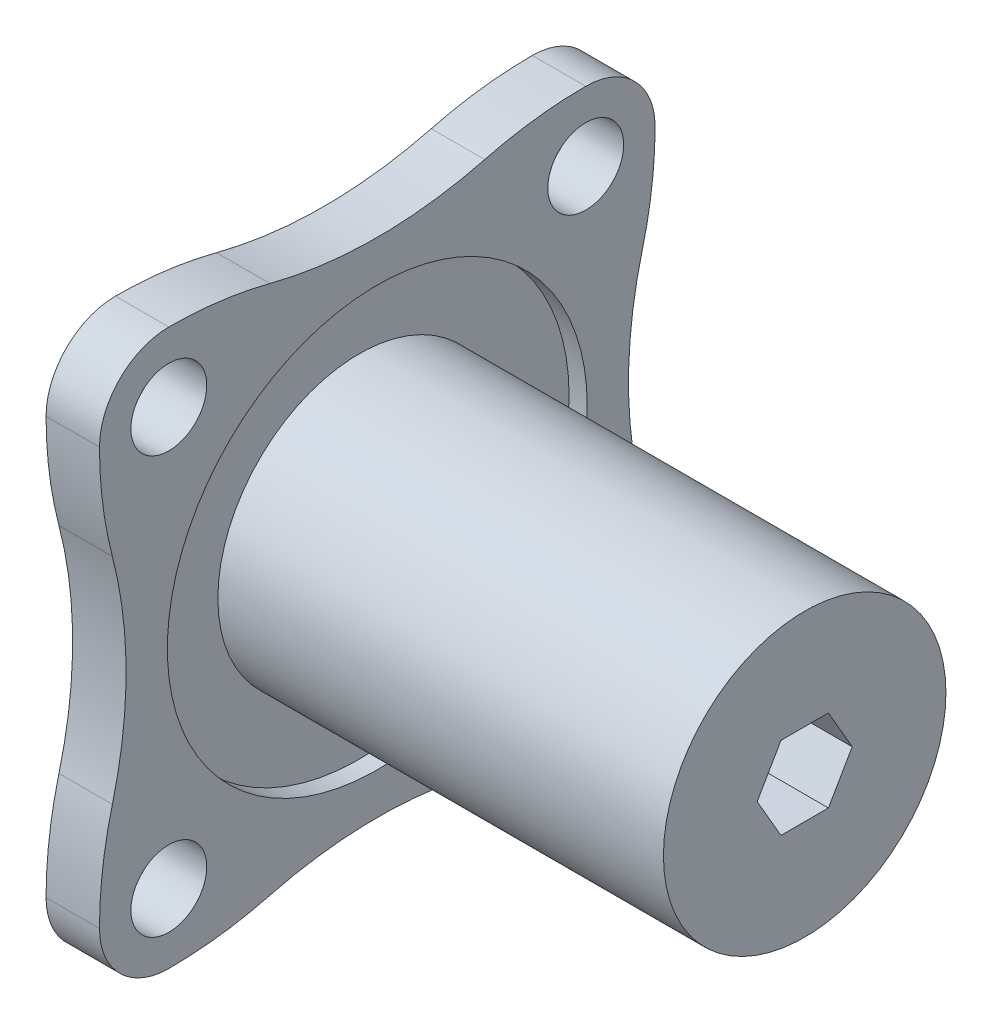
ISO-10303-21;
HEADER;
FILE_DESCRIPTION(('STEP AP214'),'2;1');
FILE_NAME('part.step','',(''),(''),'','','');
FILE_SCHEMA(('AUTOMOTIVE_DESIGN { 1 0 10303 214 1 1 1 1 }'));
ENDSEC;
DATA;
#1=APPLICATION_CONTEXT('core data for automotive mechanical design processes');
#2=APPLICATION_PROTOCOL_DEFINITION('international standard','automotive_design',2000,#1);
#3=PRODUCT_CONTEXT('',#1,'mechanical');
#4=PRODUCT('Part','Part','',(#3));
#5=PRODUCT_RELATED_PRODUCT_CATEGORY('part','',(#4));
#6=PRODUCT_DEFINITION_FORMATION('','',#4);
#7=PRODUCT_DEFINITION_CONTEXT('part definition',#1,'design');
#8=PRODUCT_DEFINITION('design','',#6,#7);
#9=PRODUCT_DEFINITION_SHAPE('','',#8);
#10=(LENGTH_UNIT() NAMED_UNIT(*) SI_UNIT(.MILLI.,.METRE.));
#11=(NAMED_UNIT(*) PLANE_ANGLE_UNIT() SI_UNIT($,.RADIAN.));
#12=(NAMED_UNIT(*) SI_UNIT($,.STERADIAN.) SOLID_ANGLE_UNIT());
#13=UNCERTAINTY_MEASURE_WITH_UNIT(LENGTH_MEASURE(1.E-05),#10,'distance_accuracy_value','');
#14=(GEOMETRIC_REPRESENTATION_CONTEXT(3) GLOBAL_UNCERTAINTY_ASSIGNED_CONTEXT((#13)) GLOBAL_UNIT_ASSIGNED_CONTEXT((#10,
#11,#12)) REPRESENTATION_CONTEXT('',''));
#15=CARTESIAN_POINT('',(0.,0.,0.));
#16=DIRECTION('',(0.,0.,1.));
#17=DIRECTION('',(1.,0.,0.));
#18=AXIS2_PLACEMENT_3D('',#15,#16,#17);
#19=CARTESIAN_POINT('',(50.8,0.,0.));
#20=DIRECTION('',(1.,0.,0.));
#21=DIRECTION('',(0.,0.,-1.));
#22=AXIS2_PLACEMENT_3D('',#19,#20,#21);
#23=PLANE('',#22);
#24=CARTESIAN_POINT('',(50.8,0.,0.));
#25=DIRECTION('',(1.,0.,0.));
#26=DIRECTION('',(0.,0.,-1.));
#27=AXIS2_PLACEMENT_3D('',#24,#25,#26);
#28=CIRCLE('',#27,16.7894);
#29=CARTESIAN_POINT('',(50.8,0.,-16.7894));
#30=VERTEX_POINT('',#29);
#31=EDGE_CURVE('E11',#30,#30,#28,.T.);
#32=ORIENTED_EDGE('',*,*,#31,.T.);
#33=EDGE_LOOP('',(#32));
#34=FACE_BOUND('',#33,.T.);
#35=DIRECTION('',(0.,0.,-1.));
#36=VECTOR('',#35,1.);
#37=CARTESIAN_POINT('',(50.8,-4.8895,2.82295414120268));
#38=LINE('',#37,#36);
#39=CARTESIAN_POINT('',(50.8,-4.8895,2.82295414120268));
#40=VERTEX_POINT('',#39);
#41=CARTESIAN_POINT('',(50.8,-4.8895,-2.82295414120268));
#42=VERTEX_POINT('',#41);
#43=EDGE_CURVE('E429',#40,#42,#38,.T.);
#44=ORIENTED_EDGE('',*,*,#43,.F.);
#45=DIRECTION('',(0.,-0.866025403784439,-0.5));
#46=VECTOR('',#45,1.);
#47=CARTESIAN_POINT('',(50.8,0.,5.64590828240535));
#48=LINE('',#47,#46);
#49=CARTESIAN_POINT('',(50.8,0.,5.64590828240535));
#50=VERTEX_POINT('',#49);
#51=EDGE_CURVE('E426',#50,#40,#48,.T.);
#52=ORIENTED_EDGE('',*,*,#51,.F.);
#53=DIRECTION('',(0.,-0.866025403784439,0.5));
#54=VECTOR('',#53,1.);
#55=CARTESIAN_POINT('',(50.8,4.8895,2.82295414120268));
#56=LINE('',#55,#54);
#57=CARTESIAN_POINT('',(50.8,4.8895,2.82295414120268));
#58=VERTEX_POINT('',#57);
#59=EDGE_CURVE('E64',#58,#50,#56,.T.);
#60=ORIENTED_EDGE('',*,*,#59,.F.);
#61=DIRECTION('',(0.,0.,1.));
#62=VECTOR('',#61,1.);
#63=CARTESIAN_POINT('',(50.8,4.8895,-2.82295414120267));
#64=LINE('',#63,#62);
#65=CARTESIAN_POINT('',(50.8,4.8895,-2.82295414120267));
#66=VERTEX_POINT('',#65);
#67=EDGE_CURVE('E197',#66,#58,#64,.T.);
#68=ORIENTED_EDGE('',*,*,#67,.F.);
#69=DIRECTION('',(0.,0.866025403784439,0.5));
#70=VECTOR('',#69,1.);
#71=CARTESIAN_POINT('',(50.8,0.,-5.64590828240535));
#72=LINE('',#71,#70);
#73=CARTESIAN_POINT('',(50.8,0.,-5.64590828240535));
#74=VERTEX_POINT('',#73);
#75=EDGE_CURVE('E435',#74,#66,#72,.T.);
#76=ORIENTED_EDGE('',*,*,#75,.F.);
#77=DIRECTION('',(0.,0.866025403784439,-0.5));
#78=VECTOR('',#77,1.);
#79=CARTESIAN_POINT('',(50.8,-4.8895,-2.82295414120268));
#80=LINE('',#79,#78);
#81=EDGE_CURVE('E432',#42,#74,#80,.T.);
#82=ORIENTED_EDGE('',*,*,#81,.F.);
#83=EDGE_LOOP('',(#44,#52,#60,#68,#76,#82));
#84=FACE_BOUND('',#83,.T.);
#85=ADVANCED_FACE('F43',(#34,#84),#23,.T.);
#86=CARTESIAN_POINT('',(50.8,0.,0.));
#87=DIRECTION('',(-1.,0.,0.));
#88=DIRECTION('',(0.,0.,1.));
#89=AXIS2_PLACEMENT_3D('',#86,#87,#88);
#90=CYLINDRICAL_SURFACE('',#89,16.7894);
#91=ORIENTED_EDGE('',*,*,#31,.F.);
#92=EDGE_LOOP('',(#91));
#93=FACE_BOUND('',#92,.T.);
#94=CARTESIAN_POINT('',(-2.159,0.,0.));
#95=DIRECTION('',(1.,0.,0.));
#96=DIRECTION('',(0.,0.,-1.));
#97=AXIS2_PLACEMENT_3D('',#94,#95,#96);
#98=CIRCLE('',#97,16.7894);
#99=CARTESIAN_POINT('',(-2.159,0.,-16.7894));
#100=VERTEX_POINT('',#99);
#101=EDGE_CURVE('E587',#100,#100,#98,.T.);
#102=ORIENTED_EDGE('',*,*,#101,.T.);
#103=EDGE_LOOP('',(#102));
#104=FACE_BOUND('',#103,.T.);
#105=ADVANCED_FACE('F45',(#93,#104),#90,.T.);
#106=CARTESIAN_POINT('',(50.8,0.,5.64590828240535));
#107=DIRECTION('',(0.,0.5,-0.866025403784439));
#108=DIRECTION('',(0.,0.866025403784439,0.5));
#109=AXIS2_PLACEMENT_3D('',#106,#107,#108);
#110=PLANE('',#109);
#111=DIRECTION('',(-1.,0.,0.));
#112=VECTOR('',#111,1.);
#113=CARTESIAN_POINT('',(50.8,-4.8895,2.82295414120268));
#114=LINE('',#113,#112);
#115=CARTESIAN_POINT('',(-6.35,-4.88950000000002,2.82295414120267));
#116=VERTEX_POINT('',#115);
#117=EDGE_CURVE('E52',#40,#116,#114,.T.);
#118=ORIENTED_EDGE('',*,*,#117,.T.);
#119=DIRECTION('',(0.,0.866025403784439,0.5));
#120=VECTOR('',#119,1.);
#121=CARTESIAN_POINT('',(-6.35,-4.88950000000002,2.82295414120268));
#122=LINE('',#121,#120);
#123=CARTESIAN_POINT('',(-6.35,0.,5.64590828240536));
#124=VERTEX_POINT('',#123);
#125=EDGE_CURVE('E229',#116,#124,#122,.T.);
#126=ORIENTED_EDGE('',*,*,#125,.T.);
#127=DIRECTION('',(-1.,0.,0.));
#128=VECTOR('',#127,1.);
#129=CARTESIAN_POINT('',(50.8,0.,5.64590828240535));
#130=LINE('',#129,#128);
#131=EDGE_CURVE('E200',#50,#124,#130,.T.);
#132=ORIENTED_EDGE('',*,*,#131,.F.);
#133=ORIENTED_EDGE('',*,*,#51,.T.);
#134=EDGE_LOOP('',(#118,#126,#132,#133));
#135=FACE_BOUND('',#134,.T.);
#136=ADVANCED_FACE('F454',(#135),#110,.T.);
#137=CARTESIAN_POINT('',(50.8,-4.8895,2.82295414120268));
#138=DIRECTION('',(0.,1.,0.));
#139=DIRECTION('',(0.,0.,1.));
#140=AXIS2_PLACEMENT_3D('',#137,#138,#139);
#141=PLANE('',#140);
#142=DIRECTION('',(-1.,0.,0.));
#143=VECTOR('',#142,1.);
#144=CARTESIAN_POINT('',(50.8,-4.8895,-2.82295414120268));
#145=LINE('',#144,#143);
#146=CARTESIAN_POINT('',(-6.35,-4.88950000000002,-2.82295414120269));
#147=VERTEX_POINT('',#146);
#148=EDGE_CURVE('E449',#42,#147,#145,.T.);
#149=ORIENTED_EDGE('',*,*,#148,.T.);
#150=DIRECTION('',(0.,0.,1.));
#151=VECTOR('',#150,1.);
#152=CARTESIAN_POINT('',(-6.35,-4.88950000000002,-2.82295414120269));
#153=LINE('',#152,#151);
#154=EDGE_CURVE('E225',#147,#116,#153,.T.);
#155=ORIENTED_EDGE('',*,*,#154,.T.);
#156=ORIENTED_EDGE('',*,*,#117,.F.);
#157=ORIENTED_EDGE('',*,*,#43,.T.);
#158=EDGE_LOOP('',(#149,#155,#156,#157));
#159=FACE_BOUND('',#158,.T.);
#160=ADVANCED_FACE('F459',(#159),#141,.T.);
#161=CARTESIAN_POINT('',(50.8,-4.8895,-2.82295414120268));
#162=DIRECTION('',(0.,0.5,0.866025403784439));
#163=DIRECTION('',(0.,-0.866025403784439,0.5));
#164=AXIS2_PLACEMENT_3D('',#161,#162,#163);
#165=PLANE('',#164);
#166=DIRECTION('',(-1.,0.,0.));
#167=VECTOR('',#166,1.);
#168=CARTESIAN_POINT('',(50.8,0.,-5.64590828240535));
#169=LINE('',#168,#167);
#170=CARTESIAN_POINT('',(-6.35,0.,-5.64590828240537));
#171=VERTEX_POINT('',#170);
#172=EDGE_CURVE('E446',#74,#171,#169,.T.);
#173=ORIENTED_EDGE('',*,*,#172,.T.);
#174=DIRECTION('',(0.,-0.866025403784439,0.5));
#175=VECTOR('',#174,1.);
#176=CARTESIAN_POINT('',(-6.35,0.,-5.64590828240537));
#177=LINE('',#176,#175);
#178=EDGE_CURVE('E218',#171,#147,#177,.T.);
#179=ORIENTED_EDGE('',*,*,#178,.T.);
#180=ORIENTED_EDGE('',*,*,#148,.F.);
#181=ORIENTED_EDGE('',*,*,#81,.T.);
#182=EDGE_LOOP('',(#173,#179,#180,#181));
#183=FACE_BOUND('',#182,.T.);
#184=ADVANCED_FACE('F462',(#183),#165,.T.);
#185=CARTESIAN_POINT('',(50.8,0.,-5.64590828240535));
#186=DIRECTION('',(0.,-0.5,0.866025403784438));
#187=DIRECTION('',(0.,-0.866025403784439,-0.5));
#188=AXIS2_PLACEMENT_3D('',#185,#186,#187);
#189=PLANE('',#188);
#190=DIRECTION('',(-1.,0.,0.));
#191=VECTOR('',#190,1.);
#192=CARTESIAN_POINT('',(50.8,4.8895,-2.82295414120267));
#193=LINE('',#192,#191);
#194=CARTESIAN_POINT('',(-6.35,4.8895,-2.82295414120268));
#195=VERTEX_POINT('',#194);
#196=EDGE_CURVE('E199',#66,#195,#193,.T.);
#197=ORIENTED_EDGE('',*,*,#196,.T.);
#198=DIRECTION('',(0.,-0.866025403784439,-0.5));
#199=VECTOR('',#198,1.);
#200=CARTESIAN_POINT('',(-6.35,4.8895,-2.82295414120268));
#201=LINE('',#200,#199);
#202=EDGE_CURVE('E214',#195,#171,#201,.T.);
#203=ORIENTED_EDGE('',*,*,#202,.T.);
#204=ORIENTED_EDGE('',*,*,#172,.F.);
#205=ORIENTED_EDGE('',*,*,#75,.T.);
#206=EDGE_LOOP('',(#197,#203,#204,#205));
#207=FACE_BOUND('',#206,.T.);
#208=ADVANCED_FACE('F467',(#207),#189,.T.);
#209=CARTESIAN_POINT('',(50.8,4.8895,-2.82295414120267));
#210=DIRECTION('',(0.,-1.,0.));
#211=DIRECTION('',(0.,0.,-1.));
#212=AXIS2_PLACEMENT_3D('',#209,#210,#211);
#213=PLANE('',#212);
#214=DIRECTION('',(-1.,0.,0.));
#215=VECTOR('',#214,1.);
#216=CARTESIAN_POINT('',(50.8,4.8895,2.82295414120268));
#217=LINE('',#216,#215);
#218=CARTESIAN_POINT('',(-6.35,4.8895,2.82295414120268));
#219=VERTEX_POINT('',#218);
#220=EDGE_CURVE('E59',#58,#219,#217,.T.);
#221=ORIENTED_EDGE('',*,*,#220,.T.);
#222=DIRECTION('',(0.,0.,-1.));
#223=VECTOR('',#222,1.);
#224=CARTESIAN_POINT('',(-6.35,4.8895,2.82295414120268));
#225=LINE('',#224,#223);
#226=EDGE_CURVE('E194',#219,#195,#225,.T.);
#227=ORIENTED_EDGE('',*,*,#226,.T.);
#228=ORIENTED_EDGE('',*,*,#196,.F.);
#229=ORIENTED_EDGE('',*,*,#67,.T.);
#230=EDGE_LOOP('',(#221,#227,#228,#229));
#231=FACE_BOUND('',#230,.T.);
#232=ADVANCED_FACE('F191',(#231),#213,.T.);
#233=CARTESIAN_POINT('',(50.8,4.8895,2.82295414120268));
#234=DIRECTION('',(0.,-0.5,-0.866025403784439));
#235=DIRECTION('',(0.,0.866025403784439,-0.5));
#236=AXIS2_PLACEMENT_3D('',#233,#234,#235);
#237=PLANE('',#236);
#238=ORIENTED_EDGE('',*,*,#131,.T.);
#239=DIRECTION('',(0.,0.866025403784439,-0.5));
#240=VECTOR('',#239,1.);
#241=CARTESIAN_POINT('',(-6.35,0.,5.64590828240536));
#242=LINE('',#241,#240);
#243=EDGE_CURVE('E203',#124,#219,#242,.T.);
#244=ORIENTED_EDGE('',*,*,#243,.T.);
#245=ORIENTED_EDGE('',*,*,#220,.F.);
#246=ORIENTED_EDGE('',*,*,#59,.T.);
#247=EDGE_LOOP('',(#238,#244,#245,#246));
#248=FACE_BOUND('',#247,.T.);
#249=ADVANCED_FACE('F204',(#248),#237,.T.);
#250=CARTESIAN_POINT('',(-6.35,32.9128405622486,-12.38885));
#251=DIRECTION('',(1.,0.,0.));
#252=DIRECTION('',(0.,0.,-1.));
#253=AXIS2_PLACEMENT_3D('',#250,#251,#252);
#254=PLANE('',#253);
#255=CARTESIAN_POINT('',(-6.35,-24.7777000000001,24.7777));
#256=DIRECTION('',(-1.,0.,0.));
#257=DIRECTION('',(0.,0.,1.));
#258=AXIS2_PLACEMENT_3D('',#255,#256,#257);
#259=CIRCLE('',#258,4.5085);
#260=CARTESIAN_POINT('',(-6.35,-24.7777000000001,29.2862));
#261=VERTEX_POINT('',#260);
#262=EDGE_CURVE('E233',#261,#261,#259,.T.);
#263=ORIENTED_EDGE('',*,*,#262,.F.);
#264=EDGE_LOOP('',(#263));
#265=FACE_BOUND('',#264,.T.);
#266=CARTESIAN_POINT('',(-6.35,-24.7777000000001,-24.7776999999999));
#267=DIRECTION('',(-1.,0.,0.));
#268=DIRECTION('',(0.,0.,1.));
#269=AXIS2_PLACEMENT_3D('',#266,#267,#268);
#270=CIRCLE('',#269,4.50850000000001);
#271=CARTESIAN_POINT('',(-6.35,-24.7777000000001,-20.2691999999999));
#272=VERTEX_POINT('',#271);
#273=EDGE_CURVE('E241',#272,#272,#270,.T.);
#274=ORIENTED_EDGE('',*,*,#273,.F.);
#275=EDGE_LOOP('',(#274));
#276=FACE_BOUND('',#275,.T.);
#277=CARTESIAN_POINT('',(-6.35,24.7776999999999,-24.7776999999999));
#278=DIRECTION('',(-1.,0.,0.));
#279=DIRECTION('',(0.,0.,1.));
#280=AXIS2_PLACEMENT_3D('',#277,#278,#279);
#281=CIRCLE('',#280,4.5085);
#282=CARTESIAN_POINT('',(-6.35,24.7776999999999,-20.2691999999999));
#283=VERTEX_POINT('',#282);
#284=EDGE_CURVE('E249',#283,#283,#281,.T.);
#285=ORIENTED_EDGE('',*,*,#284,.F.);
#286=EDGE_LOOP('',(#285));
#287=FACE_BOUND('',#286,.T.);
#288=CARTESIAN_POINT('',(-6.35,24.7776999999999,24.7777));
#289=DIRECTION('',(-1.,0.,0.));
#290=DIRECTION('',(0.,0.,1.));
#291=AXIS2_PLACEMENT_3D('',#288,#289,#290);
#292=CIRCLE('',#291,4.50850000000001);
#293=CARTESIAN_POINT('',(-6.35,24.7776999999999,29.2862));
#294=VERTEX_POINT('',#293);
#295=EDGE_CURVE('E257',#294,#294,#292,.T.);
#296=ORIENTED_EDGE('',*,*,#295,.F.);
#297=EDGE_LOOP('',(#296));
#298=FACE_BOUND('',#297,.T.);
#299=CARTESIAN_POINT('',(-6.35,-14.8320188755028,-24.7777));
#300=DIRECTION('',(-1.,0.,0.));
#301=DIRECTION('',(0.,0.,-1.));
#302=AXIS2_PLACEMENT_3D('',#299,#300,#301);
#303=CIRCLE('',#302,47.8520188755028);
#304=CARTESIAN_POINT('',(-6.35,31.4860989099375,-12.7590613385061));
#305=VERTEX_POINT('',#304);
#306=CARTESIAN_POINT('',(-6.35,33.02,-24.7776999999999));
#307=VERTEX_POINT('',#306);
#308=EDGE_CURVE('E265',#305,#307,#303,.T.);
#309=ORIENTED_EDGE('',*,*,#308,.T.);
#310=CARTESIAN_POINT('',(-6.35,24.7777,-24.7776999999999));
#311=DIRECTION('',(-1.,0.,0.));
#312=DIRECTION('',(0.,0.,1.));
#313=AXIS2_PLACEMENT_3D('',#310,#311,#312);
#314=CIRCLE('',#313,8.24230000000004);
#315=CARTESIAN_POINT('',(-6.35,24.7777,-33.02));
#316=VERTEX_POINT('',#315);
#317=EDGE_CURVE('E269',#307,#316,#314,.T.);
#318=ORIENTED_EDGE('',*,*,#317,.T.);
#319=CARTESIAN_POINT('',(-6.35,24.7777,14.8320188755027));
#320=DIRECTION('',(-1.,0.,0.));
#321=DIRECTION('',(0.,0.,-1.));
#322=AXIS2_PLACEMENT_3D('',#319,#320,#321);
#323=CIRCLE('',#322,47.8520188755028);
#324=CARTESIAN_POINT('',(-6.35,12.7590613385061,-31.4860989099375));
#325=VERTEX_POINT('',#324);
#326=EDGE_CURVE('E273',#316,#325,#323,.T.);
#327=ORIENTED_EDGE('',*,*,#326,.T.);
#328=CARTESIAN_POINT('',(-6.35,0.,-80.6577));
#329=DIRECTION('',(1.,0.,0.));
#330=DIRECTION('',(0.,0.,-1.));
#331=AXIS2_PLACEMENT_3D('',#328,#329,#330);
#332=CIRCLE('',#331,50.8);
#333=CARTESIAN_POINT('',(-6.35,-12.7590613385061,-31.4860989099375));
#334=VERTEX_POINT('',#333);
#335=EDGE_CURVE('E276',#325,#334,#332,.T.);
#336=ORIENTED_EDGE('',*,*,#335,.T.);
#337=CARTESIAN_POINT('',(-6.35,-24.7777,14.8320188755027));
#338=DIRECTION('',(-1.,0.,0.));
#339=DIRECTION('',(0.,0.,1.));
#340=AXIS2_PLACEMENT_3D('',#337,#338,#339);
#341=CIRCLE('',#340,47.8520188755028);
#342=CARTESIAN_POINT('',(-6.35,-24.7777,-33.02));
#343=VERTEX_POINT('',#342);
#344=EDGE_CURVE('E279',#334,#343,#341,.T.);
#345=ORIENTED_EDGE('',*,*,#344,.T.);
#346=CARTESIAN_POINT('',(-6.35,-24.7777,-24.7777));
#347=DIRECTION('',(-1.,0.,0.));
#348=DIRECTION('',(0.,0.,1.));
#349=AXIS2_PLACEMENT_3D('',#346,#347,#348);
#350=CIRCLE('',#349,8.2423);
#351=CARTESIAN_POINT('',(-6.35,-33.02,-24.7777));
#352=VERTEX_POINT('',#351);
#353=EDGE_CURVE('E282',#343,#352,#350,.T.);
#354=ORIENTED_EDGE('',*,*,#353,.T.);
#355=CARTESIAN_POINT('',(-6.35,14.8320188755028,-24.7777));
#356=DIRECTION('',(-1.,0.,0.));
#357=DIRECTION('',(0.,0.,1.));
#358=AXIS2_PLACEMENT_3D('',#355,#356,#357);
#359=CIRCLE('',#358,47.8520188755028);
#360=CARTESIAN_POINT('',(-6.35,-31.4860989099375,-12.7590613385061));
#361=VERTEX_POINT('',#360);
#362=EDGE_CURVE('E285',#352,#361,#359,.T.);
#363=ORIENTED_EDGE('',*,*,#362,.T.);
#364=CARTESIAN_POINT('',(-6.35,-80.6577,0.));
#365=DIRECTION('',(1.,0.,0.));
#366=DIRECTION('',(0.,0.,-1.));
#367=AXIS2_PLACEMENT_3D('',#364,#365,#366);
#368=CIRCLE('',#367,50.8);
#369=CARTESIAN_POINT('',(-6.35,-31.4860989099375,12.7590613385061));
#370=VERTEX_POINT('',#369);
#371=EDGE_CURVE('E288',#361,#370,#368,.T.);
#372=ORIENTED_EDGE('',*,*,#371,.T.);
#373=CARTESIAN_POINT('',(-6.35,14.8320188755028,24.7777));
#374=DIRECTION('',(-1.,0.,0.));
#375=DIRECTION('',(0.,0.,1.));
#376=AXIS2_PLACEMENT_3D('',#373,#374,#375);
#377=CIRCLE('',#376,47.8520188755028);
#378=CARTESIAN_POINT('',(-6.35,-33.02,24.7777));
#379=VERTEX_POINT('',#378);
#380=EDGE_CURVE('E291',#370,#379,#377,.T.);
#381=ORIENTED_EDGE('',*,*,#380,.T.);
#382=CARTESIAN_POINT('',(-6.35,-24.7777000000001,24.7777));
#383=DIRECTION('',(-1.,0.,0.));
#384=DIRECTION('',(0.,0.,-1.));
#385=AXIS2_PLACEMENT_3D('',#382,#383,#384);
#386=CIRCLE('',#385,8.24229999999995);
#387=CARTESIAN_POINT('',(-6.35,-24.7777,33.02));
#388=VERTEX_POINT('',#387);
#389=EDGE_CURVE('E294',#379,#388,#386,.T.);
#390=ORIENTED_EDGE('',*,*,#389,.T.);
#391=CARTESIAN_POINT('',(-6.35,-24.7777,-14.8320188755027));
#392=DIRECTION('',(-1.,0.,0.));
#393=DIRECTION('',(0.,0.,-1.));
#394=AXIS2_PLACEMENT_3D('',#391,#392,#393);
#395=CIRCLE('',#394,47.8520188755028);
#396=CARTESIAN_POINT('',(-6.35,-12.7590613385061,31.4860989099375));
#397=VERTEX_POINT('',#396);
#398=EDGE_CURVE('E297',#388,#397,#395,.T.);
#399=ORIENTED_EDGE('',*,*,#398,.T.);
#400=CARTESIAN_POINT('',(-6.35,0.,80.6577));
#401=DIRECTION('',(1.,0.,0.));
#402=DIRECTION('',(0.,0.,1.));
#403=AXIS2_PLACEMENT_3D('',#400,#401,#402);
#404=CIRCLE('',#403,50.8);
#405=CARTESIAN_POINT('',(-6.35,12.7590613385061,31.4860989099375));
#406=VERTEX_POINT('',#405);
#407=EDGE_CURVE('E300',#397,#406,#404,.T.);
#408=ORIENTED_EDGE('',*,*,#407,.T.);
#409=CARTESIAN_POINT('',(-6.35,24.7777,-14.8320188755027));
#410=DIRECTION('',(-1.,0.,0.));
#411=DIRECTION('',(0.,0.,1.));
#412=AXIS2_PLACEMENT_3D('',#409,#410,#411);
#413=CIRCLE('',#412,47.8520188755028);
#414=CARTESIAN_POINT('',(-6.35,24.7777,33.02));
#415=VERTEX_POINT('',#414);
#416=EDGE_CURVE('E303',#406,#415,#413,.T.);
#417=ORIENTED_EDGE('',*,*,#416,.T.);
#418=CARTESIAN_POINT('',(-6.35,24.7776999999999,24.7777));
#419=DIRECTION('',(-1.,0.,0.));
#420=DIRECTION('',(0.,0.,-1.));
#421=AXIS2_PLACEMENT_3D('',#418,#419,#420);
#422=CIRCLE('',#421,8.24230000000003);
#423=CARTESIAN_POINT('',(-6.35,33.02,24.7777));
#424=VERTEX_POINT('',#423);
#425=EDGE_CURVE('E306',#415,#424,#422,.T.);
#426=ORIENTED_EDGE('',*,*,#425,.T.);
#427=CARTESIAN_POINT('',(-6.35,-14.8320188755028,24.7777));
#428=DIRECTION('',(-1.,0.,0.));
#429=DIRECTION('',(0.,0.,-1.));
#430=AXIS2_PLACEMENT_3D('',#427,#428,#429);
#431=CIRCLE('',#430,47.8520188755028);
#432=CARTESIAN_POINT('',(-6.35,31.4860989099375,12.7590613385061));
#433=VERTEX_POINT('',#432);
#434=EDGE_CURVE('E309',#424,#433,#431,.T.);
#435=ORIENTED_EDGE('',*,*,#434,.T.);
#436=CARTESIAN_POINT('',(-6.35,80.6577,0.));
#437=DIRECTION('',(1.,0.,0.));
#438=DIRECTION('',(0.,0.,1.));
#439=AXIS2_PLACEMENT_3D('',#436,#437,#438);
#440=CIRCLE('',#439,50.8);
#441=EDGE_CURVE('E312',#433,#305,#440,.T.);
#442=ORIENTED_EDGE('',*,*,#441,.T.);
#443=EDGE_LOOP('',(#309,#318,#327,#336,#345,#354,#363,#372,#381,#390,#399,#408,#417,#426,#435,#442));
#444=FACE_BOUND('',#443,.T.);
#445=ORIENTED_EDGE('',*,*,#243,.F.);
#446=ORIENTED_EDGE('',*,*,#125,.F.);
#447=ORIENTED_EDGE('',*,*,#154,.F.);
#448=ORIENTED_EDGE('',*,*,#178,.F.);
#449=ORIENTED_EDGE('',*,*,#202,.F.);
#450=ORIENTED_EDGE('',*,*,#226,.F.);
#451=EDGE_LOOP('',(#445,#446,#447,#448,#449,#450));
#452=FACE_BOUND('',#451,.T.);
#453=ADVANCED_FACE('F211',(#265,#276,#287,#298,#444,#452),#254,.F.);
#454=CARTESIAN_POINT('',(0.,32.9128405622486,-12.38885));
#455=DIRECTION('',(1.,0.,0.));
#456=DIRECTION('',(0.,0.,-1.));
#457=AXIS2_PLACEMENT_3D('',#454,#455,#456);
#458=PLANE('',#457);
#459=CARTESIAN_POINT('',(0.,0.,0.));
#460=DIRECTION('',(1.,0.,0.));
#461=DIRECTION('',(0.,0.,-1.));
#462=AXIS2_PLACEMENT_3D('',#459,#460,#461);
#463=CIRCLE('',#462,24.9555);
#464=CARTESIAN_POINT('',(0.,0.,-24.9555));
#465=VERTEX_POINT('',#464);
#466=EDGE_CURVE('E591',#465,#465,#463,.T.);
#467=ORIENTED_EDGE('',*,*,#466,.F.);
#468=EDGE_LOOP('',(#467));
#469=FACE_BOUND('',#468,.T.);
#470=CARTESIAN_POINT('',(0.,-24.7777000000001,-24.7776999999999));
#471=DIRECTION('',(-1.,0.,0.));
#472=DIRECTION('',(0.,0.,1.));
#473=AXIS2_PLACEMENT_3D('',#470,#471,#472);
#474=CIRCLE('',#473,4.50850000000001);
#475=CARTESIAN_POINT('',(0.,-24.7777000000001,-20.2691999999999));
#476=VERTEX_POINT('',#475);
#477=EDGE_CURVE('E237',#476,#476,#474,.T.);
#478=ORIENTED_EDGE('',*,*,#477,.T.);
#479=EDGE_LOOP('',(#478));
#480=FACE_BOUND('',#479,.T.);
#481=CARTESIAN_POINT('',(0.,24.7776999999999,24.7777));
#482=DIRECTION('',(-1.,0.,0.));
#483=DIRECTION('',(0.,0.,1.));
#484=AXIS2_PLACEMENT_3D('',#481,#482,#483);
#485=CIRCLE('',#484,4.50850000000001);
#486=CARTESIAN_POINT('',(0.,24.7776999999999,29.2862));
#487=VERTEX_POINT('',#486);
#488=EDGE_CURVE('E253',#487,#487,#485,.T.);
#489=ORIENTED_EDGE('',*,*,#488,.T.);
#490=EDGE_LOOP('',(#489));
#491=FACE_BOUND('',#490,.T.);
#492=CARTESIAN_POINT('',(0.,-14.8320188755028,-24.7777));
#493=DIRECTION('',(-1.,0.,0.));
#494=DIRECTION('',(0.,0.,-1.));
#495=AXIS2_PLACEMENT_3D('',#492,#493,#494);
#496=CIRCLE('',#495,47.8520188755028);
#497=CARTESIAN_POINT('',(0.,31.4860989099375,-12.7590613385061));
#498=VERTEX_POINT('',#497);
#499=CARTESIAN_POINT('',(0.,33.02,-24.7776999999999));
#500=VERTEX_POINT('',#499);
#501=EDGE_CURVE('E261',#498,#500,#496,.T.);
#502=ORIENTED_EDGE('',*,*,#501,.F.);
#503=CARTESIAN_POINT('',(0.,80.6577,0.));
#504=DIRECTION('',(1.,0.,0.));
#505=DIRECTION('',(0.,0.,1.));
#506=AXIS2_PLACEMENT_3D('',#503,#504,#505);
#507=CIRCLE('',#506,50.8);
#508=CARTESIAN_POINT('',(0.,31.4860989099375,12.7590613385061));
#509=VERTEX_POINT('',#508);
#510=EDGE_CURVE('E270',#509,#498,#507,.T.);
#511=ORIENTED_EDGE('',*,*,#510,.F.);
#512=CARTESIAN_POINT('',(0.,-14.8320188755028,24.7777));
#513=DIRECTION('',(-1.,0.,0.));
#514=DIRECTION('',(0.,0.,-1.));
#515=AXIS2_PLACEMENT_3D('',#512,#513,#514);
#516=CIRCLE('',#515,47.8520188755028);
#517=CARTESIAN_POINT('',(0.,33.02,24.7777));
#518=VERTEX_POINT('',#517);
#519=EDGE_CURVE('E358',#518,#509,#516,.T.);
#520=ORIENTED_EDGE('',*,*,#519,.F.);
#521=CARTESIAN_POINT('',(0.,24.7776999999999,24.7777));
#522=DIRECTION('',(-1.,0.,0.));
#523=DIRECTION('',(0.,0.,-1.));
#524=AXIS2_PLACEMENT_3D('',#521,#522,#523);
#525=CIRCLE('',#524,8.24230000000003);
#526=CARTESIAN_POINT('',(0.,24.7777,33.02));
#527=VERTEX_POINT('',#526);
#528=EDGE_CURVE('E355',#527,#518,#525,.T.);
#529=ORIENTED_EDGE('',*,*,#528,.F.);
#530=CARTESIAN_POINT('',(0.,24.7777,-14.8320188755027));
#531=DIRECTION('',(-1.,0.,0.));
#532=DIRECTION('',(0.,0.,1.));
#533=AXIS2_PLACEMENT_3D('',#530,#531,#532);
#534=CIRCLE('',#533,47.8520188755028);
#535=CARTESIAN_POINT('',(0.,12.7590613385061,31.4860989099375));
#536=VERTEX_POINT('',#535);
#537=EDGE_CURVE('E352',#536,#527,#534,.T.);
#538=ORIENTED_EDGE('',*,*,#537,.F.);
#539=CARTESIAN_POINT('',(0.,0.,80.6577));
#540=DIRECTION('',(1.,0.,0.));
#541=DIRECTION('',(0.,0.,1.));
#542=AXIS2_PLACEMENT_3D('',#539,#540,#541);
#543=CIRCLE('',#542,50.8);
#544=CARTESIAN_POINT('',(0.,-12.7590613385061,31.4860989099375));
#545=VERTEX_POINT('',#544);
#546=EDGE_CURVE('E349',#545,#536,#543,.T.);
#547=ORIENTED_EDGE('',*,*,#546,.F.);
#548=CARTESIAN_POINT('',(0.,-24.7777,-14.8320188755027));
#549=DIRECTION('',(-1.,0.,0.));
#550=DIRECTION('',(0.,0.,-1.));
#551=AXIS2_PLACEMENT_3D('',#548,#549,#550);
#552=CIRCLE('',#551,47.8520188755028);
#553=CARTESIAN_POINT('',(0.,-24.7777,33.02));
#554=VERTEX_POINT('',#553);
#555=EDGE_CURVE('E346',#554,#545,#552,.T.);
#556=ORIENTED_EDGE('',*,*,#555,.F.);
#557=CARTESIAN_POINT('',(0.,-24.7777000000001,24.7777));
#558=DIRECTION('',(-1.,0.,0.));
#559=DIRECTION('',(0.,0.,-1.));
#560=AXIS2_PLACEMENT_3D('',#557,#558,#559);
#561=CIRCLE('',#560,8.24229999999995);
#562=CARTESIAN_POINT('',(0.,-33.02,24.7777));
#563=VERTEX_POINT('',#562);
#564=EDGE_CURVE('E343',#563,#554,#561,.T.);
#565=ORIENTED_EDGE('',*,*,#564,.F.);
#566=CARTESIAN_POINT('',(0.,14.8320188755028,24.7777));
#567=DIRECTION('',(-1.,0.,0.));
#568=DIRECTION('',(0.,0.,1.));
#569=AXIS2_PLACEMENT_3D('',#566,#567,#568);
#570=CIRCLE('',#569,47.8520188755028);
#571=CARTESIAN_POINT('',(0.,-31.4860989099375,12.7590613385061));
#572=VERTEX_POINT('',#571);
#573=EDGE_CURVE('E340',#572,#563,#570,.T.);
#574=ORIENTED_EDGE('',*,*,#573,.F.);
#575=CARTESIAN_POINT('',(0.,-80.6577,0.));
#576=DIRECTION('',(1.,0.,0.));
#577=DIRECTION('',(0.,0.,-1.));
#578=AXIS2_PLACEMENT_3D('',#575,#576,#577);
#579=CIRCLE('',#578,50.8);
#580=CARTESIAN_POINT('',(0.,-31.4860989099375,-12.7590613385061));
#581=VERTEX_POINT('',#580);
#582=EDGE_CURVE('E337',#581,#572,#579,.T.);
#583=ORIENTED_EDGE('',*,*,#582,.F.);
#584=CARTESIAN_POINT('',(0.,14.8320188755028,-24.7777));
#585=DIRECTION('',(-1.,0.,0.));
#586=DIRECTION('',(0.,0.,1.));
#587=AXIS2_PLACEMENT_3D('',#584,#585,#586);
#588=CIRCLE('',#587,47.8520188755028);
#589=CARTESIAN_POINT('',(0.,-33.02,-24.7777));
#590=VERTEX_POINT('',#589);
#591=EDGE_CURVE('E334',#590,#581,#588,.T.);
#592=ORIENTED_EDGE('',*,*,#591,.F.);
#593=CARTESIAN_POINT('',(0.,-24.7777,-24.7777));
#594=DIRECTION('',(-1.,0.,0.));
#595=DIRECTION('',(0.,0.,1.));
#596=AXIS2_PLACEMENT_3D('',#593,#594,#595);
#597=CIRCLE('',#596,8.2423);
#598=CARTESIAN_POINT('',(0.,-24.7777,-33.02));
#599=VERTEX_POINT('',#598);
#600=EDGE_CURVE('E331',#599,#590,#597,.T.);
#601=ORIENTED_EDGE('',*,*,#600,.F.);
#602=CARTESIAN_POINT('',(0.,-24.7777,14.8320188755027));
#603=DIRECTION('',(-1.,0.,0.));
#604=DIRECTION('',(0.,0.,1.));
#605=AXIS2_PLACEMENT_3D('',#602,#603,#604);
#606=CIRCLE('',#605,47.8520188755028);
#607=CARTESIAN_POINT('',(0.,-12.7590613385061,-31.4860989099375));
#608=VERTEX_POINT('',#607);
#609=EDGE_CURVE('E328',#608,#599,#606,.T.);
#610=ORIENTED_EDGE('',*,*,#609,.F.);
#611=CARTESIAN_POINT('',(0.,0.,-80.6577));
#612=DIRECTION('',(1.,0.,0.));
#613=DIRECTION('',(0.,0.,-1.));
#614=AXIS2_PLACEMENT_3D('',#611,#612,#613);
#615=CIRCLE('',#614,50.8);
#616=CARTESIAN_POINT('',(0.,12.7590613385061,-31.4860989099375));
#617=VERTEX_POINT('',#616);
#618=EDGE_CURVE('E325',#617,#608,#615,.T.);
#619=ORIENTED_EDGE('',*,*,#618,.F.);
#620=CARTESIAN_POINT('',(0.,24.7777,14.8320188755027));
#621=DIRECTION('',(-1.,0.,0.));
#622=DIRECTION('',(0.,0.,-1.));
#623=AXIS2_PLACEMENT_3D('',#620,#621,#622);
#624=CIRCLE('',#623,47.8520188755028);
#625=CARTESIAN_POINT('',(0.,24.7777,-33.02));
#626=VERTEX_POINT('',#625);
#627=EDGE_CURVE('E322',#626,#617,#624,.T.);
#628=ORIENTED_EDGE('',*,*,#627,.F.);
#629=CARTESIAN_POINT('',(0.,24.7777,-24.7776999999999));
#630=DIRECTION('',(-1.,0.,0.));
#631=DIRECTION('',(0.,0.,1.));
#632=AXIS2_PLACEMENT_3D('',#629,#630,#631);
#633=CIRCLE('',#632,8.24230000000004);
#634=EDGE_CURVE('E319',#500,#626,#633,.T.);
#635=ORIENTED_EDGE('',*,*,#634,.F.);
#636=EDGE_LOOP('',(#502,#511,#520,#529,#538,#547,#556,#565,#574,#583,#592,#601,#610,#619,#628,#635));
#637=FACE_BOUND('',#636,.T.);
#638=CARTESIAN_POINT('',(0.,24.7776999999999,-24.7776999999999));
#639=DIRECTION('',(-1.,0.,0.));
#640=DIRECTION('',(0.,0.,1.));
#641=AXIS2_PLACEMENT_3D('',#638,#639,#640);
#642=CIRCLE('',#641,4.5085);
#643=CARTESIAN_POINT('',(0.,24.7776999999999,-20.2691999999999));
#644=VERTEX_POINT('',#643);
#645=EDGE_CURVE('E245',#644,#644,#642,.T.);
#646=ORIENTED_EDGE('',*,*,#645,.T.);
#647=EDGE_LOOP('',(#646));
#648=FACE_BOUND('',#647,.T.);
#649=CARTESIAN_POINT('',(0.,-24.7777000000001,24.7777));
#650=DIRECTION('',(-1.,0.,0.));
#651=DIRECTION('',(0.,0.,1.));
#652=AXIS2_PLACEMENT_3D('',#649,#650,#651);
#653=CIRCLE('',#652,4.5085);
#654=CARTESIAN_POINT('',(0.,-24.7777000000001,29.2862));
#655=VERTEX_POINT('',#654);
#656=EDGE_CURVE('E232',#655,#655,#653,.T.);
#657=ORIENTED_EDGE('',*,*,#656,.T.);
#658=EDGE_LOOP('',(#657));
#659=FACE_BOUND('',#658,.T.);
#660=ADVANCED_FACE('F492',(#469,#480,#491,#637,#648,#659),#458,.T.);
#661=CARTESIAN_POINT('',(-6.35,-14.8320188755028,-24.7777));
#662=DIRECTION('',(1.,0.,0.));
#663=DIRECTION('',(0.,0.,-1.));
#664=AXIS2_PLACEMENT_3D('',#661,#662,#663);
#665=CYLINDRICAL_SURFACE('',#664,47.8520188755028);
#666=ORIENTED_EDGE('',*,*,#501,.T.);
#667=DIRECTION('',(1.,0.,0.));
#668=VECTOR('',#667,1.);
#669=CARTESIAN_POINT('',(-6.35,33.02,-24.7776999999999));
#670=LINE('',#669,#668);
#671=EDGE_CURVE('E422',#307,#500,#670,.T.);
#672=ORIENTED_EDGE('',*,*,#671,.F.);
#673=ORIENTED_EDGE('',*,*,#308,.F.);
#674=DIRECTION('',(1.,0.,0.));
#675=VECTOR('',#674,1.);
#676=CARTESIAN_POINT('',(-6.35,31.4860989099375,-12.7590613385061));
#677=LINE('',#676,#675);
#678=EDGE_CURVE('E315',#305,#498,#677,.T.);
#679=ORIENTED_EDGE('',*,*,#678,.T.);
#680=EDGE_LOOP('',(#666,#672,#673,#679));
#681=FACE_BOUND('',#680,.T.);
#682=ADVANCED_FACE('F488',(#681),#665,.T.);
#683=CARTESIAN_POINT('',(-6.35,24.7777,-24.7776999999999));
#684=DIRECTION('',(1.,0.,0.));
#685=DIRECTION('',(0.,0.,-1.));
#686=AXIS2_PLACEMENT_3D('',#683,#684,#685);
#687=CYLINDRICAL_SURFACE('',#686,8.24230000000004);
#688=ORIENTED_EDGE('',*,*,#634,.T.);
#689=DIRECTION('',(1.,0.,0.));
#690=VECTOR('',#689,1.);
#691=CARTESIAN_POINT('',(-6.35,24.7777,-33.02));
#692=LINE('',#691,#690);
#693=EDGE_CURVE('E418',#316,#626,#692,.T.);
#694=ORIENTED_EDGE('',*,*,#693,.F.);
#695=ORIENTED_EDGE('',*,*,#317,.F.);
#696=ORIENTED_EDGE('',*,*,#671,.T.);
#697=EDGE_LOOP('',(#688,#694,#695,#696));
#698=FACE_BOUND('',#697,.T.);
#699=ADVANCED_FACE('F491',(#698),#687,.T.);
#700=CARTESIAN_POINT('',(-6.35,24.7777,14.8320188755027));
#701=DIRECTION('',(1.,0.,0.));
#702=DIRECTION('',(0.,0.,-1.));
#703=AXIS2_PLACEMENT_3D('',#700,#701,#702);
#704=CYLINDRICAL_SURFACE('',#703,47.8520188755028);
#705=ORIENTED_EDGE('',*,*,#627,.T.);
#706=DIRECTION('',(1.,0.,0.));
#707=VECTOR('',#706,1.);
#708=CARTESIAN_POINT('',(-6.35,12.7590613385061,-31.4860989099375));
#709=LINE('',#708,#707);
#710=EDGE_CURVE('E414',#325,#617,#709,.T.);
#711=ORIENTED_EDGE('',*,*,#710,.F.);
#712=ORIENTED_EDGE('',*,*,#326,.F.);
#713=ORIENTED_EDGE('',*,*,#693,.T.);
#714=EDGE_LOOP('',(#705,#711,#712,#713));
#715=FACE_BOUND('',#714,.T.);
#716=ADVANCED_FACE('F496',(#715),#704,.T.);
#717=CARTESIAN_POINT('',(-6.35,0.,-80.6577));
#718=DIRECTION('',(1.,0.,0.));
#719=DIRECTION('',(0.,0.,-1.));
#720=AXIS2_PLACEMENT_3D('',#717,#718,#719);
#721=CYLINDRICAL_SURFACE('',#720,50.8);
#722=ORIENTED_EDGE('',*,*,#618,.T.);
#723=DIRECTION('',(1.,0.,0.));
#724=VECTOR('',#723,1.);
#725=CARTESIAN_POINT('',(-6.35,-12.7590613385061,-31.4860989099375));
#726=LINE('',#725,#724);
#727=EDGE_CURVE('E410',#334,#608,#726,.T.);
#728=ORIENTED_EDGE('',*,*,#727,.F.);
#729=ORIENTED_EDGE('',*,*,#335,.F.);
#730=ORIENTED_EDGE('',*,*,#710,.T.);
#731=EDGE_LOOP('',(#722,#728,#729,#730));
#732=FACE_BOUND('',#731,.T.);
#733=ADVANCED_FACE('F500',(#732),#721,.F.);
#734=CARTESIAN_POINT('',(-6.35,-24.7777,14.8320188755027));
#735=DIRECTION('',(1.,0.,0.));
#736=DIRECTION('',(0.,0.,-1.));
#737=AXIS2_PLACEMENT_3D('',#734,#735,#736);
#738=CYLINDRICAL_SURFACE('',#737,47.8520188755028);
#739=ORIENTED_EDGE('',*,*,#609,.T.);
#740=DIRECTION('',(1.,0.,0.));
#741=VECTOR('',#740,1.);
#742=CARTESIAN_POINT('',(-6.35,-24.7777,-33.02));
#743=LINE('',#742,#741);
#744=EDGE_CURVE('E406',#343,#599,#743,.T.);
#745=ORIENTED_EDGE('',*,*,#744,.F.);
#746=ORIENTED_EDGE('',*,*,#344,.F.);
#747=ORIENTED_EDGE('',*,*,#727,.T.);
#748=EDGE_LOOP('',(#739,#745,#746,#747));
#749=FACE_BOUND('',#748,.T.);
#750=ADVANCED_FACE('F504',(#749),#738,.T.);
#751=CARTESIAN_POINT('',(-6.35,-24.7777,-24.7777));
#752=DIRECTION('',(1.,0.,0.));
#753=DIRECTION('',(0.,0.,-1.));
#754=AXIS2_PLACEMENT_3D('',#751,#752,#753);
#755=CYLINDRICAL_SURFACE('',#754,8.2423);
#756=ORIENTED_EDGE('',*,*,#600,.T.);
#757=DIRECTION('',(1.,0.,0.));
#758=VECTOR('',#757,1.);
#759=CARTESIAN_POINT('',(-6.35,-33.02,-24.7777));
#760=LINE('',#759,#758);
#761=EDGE_CURVE('E402',#352,#590,#760,.T.);
#762=ORIENTED_EDGE('',*,*,#761,.F.);
#763=ORIENTED_EDGE('',*,*,#353,.F.);
#764=ORIENTED_EDGE('',*,*,#744,.T.);
#765=EDGE_LOOP('',(#756,#762,#763,#764));
#766=FACE_BOUND('',#765,.T.);
#767=ADVANCED_FACE('F508',(#766),#755,.T.);
#768=CARTESIAN_POINT('',(-6.35,14.8320188755028,-24.7777));
#769=DIRECTION('',(1.,0.,0.));
#770=DIRECTION('',(0.,0.,-1.));
#771=AXIS2_PLACEMENT_3D('',#768,#769,#770);
#772=CYLINDRICAL_SURFACE('',#771,47.8520188755028);
#773=ORIENTED_EDGE('',*,*,#591,.T.);
#774=DIRECTION('',(1.,0.,0.));
#775=VECTOR('',#774,1.);
#776=CARTESIAN_POINT('',(-6.35,-31.4860989099375,-12.7590613385061));
#777=LINE('',#776,#775);
#778=EDGE_CURVE('E398',#361,#581,#777,.T.);
#779=ORIENTED_EDGE('',*,*,#778,.F.);
#780=ORIENTED_EDGE('',*,*,#362,.F.);
#781=ORIENTED_EDGE('',*,*,#761,.T.);
#782=EDGE_LOOP('',(#773,#779,#780,#781));
#783=FACE_BOUND('',#782,.T.);
#784=ADVANCED_FACE('F512',(#783),#772,.T.);
#785=CARTESIAN_POINT('',(-6.35,-80.6577,0.));
#786=DIRECTION('',(1.,0.,0.));
#787=DIRECTION('',(0.,0.,-1.));
#788=AXIS2_PLACEMENT_3D('',#785,#786,#787);
#789=CYLINDRICAL_SURFACE('',#788,50.8);
#790=ORIENTED_EDGE('',*,*,#582,.T.);
#791=DIRECTION('',(1.,0.,0.));
#792=VECTOR('',#791,1.);
#793=CARTESIAN_POINT('',(-6.35,-31.4860989099375,12.7590613385061));
#794=LINE('',#793,#792);
#795=EDGE_CURVE('E394',#370,#572,#794,.T.);
#796=ORIENTED_EDGE('',*,*,#795,.F.);
#797=ORIENTED_EDGE('',*,*,#371,.F.);
#798=ORIENTED_EDGE('',*,*,#778,.T.);
#799=EDGE_LOOP('',(#790,#796,#797,#798));
#800=FACE_BOUND('',#799,.T.);
#801=ADVANCED_FACE('F516',(#800),#789,.F.);
#802=CARTESIAN_POINT('',(-6.35,14.8320188755028,24.7777));
#803=DIRECTION('',(1.,0.,0.));
#804=DIRECTION('',(0.,0.,-1.));
#805=AXIS2_PLACEMENT_3D('',#802,#803,#804);
#806=CYLINDRICAL_SURFACE('',#805,47.8520188755028);
#807=ORIENTED_EDGE('',*,*,#573,.T.);
#808=DIRECTION('',(1.,0.,0.));
#809=VECTOR('',#808,1.);
#810=CARTESIAN_POINT('',(-6.35,-33.02,24.7777));
#811=LINE('',#810,#809);
#812=EDGE_CURVE('E390',#379,#563,#811,.T.);
#813=ORIENTED_EDGE('',*,*,#812,.F.);
#814=ORIENTED_EDGE('',*,*,#380,.F.);
#815=ORIENTED_EDGE('',*,*,#795,.T.);
#816=EDGE_LOOP('',(#807,#813,#814,#815));
#817=FACE_BOUND('',#816,.T.);
#818=ADVANCED_FACE('F520',(#817),#806,.T.);
#819=CARTESIAN_POINT('',(-6.35,-24.7777000000001,24.7777));
#820=DIRECTION('',(1.,0.,0.));
#821=DIRECTION('',(0.,0.,-1.));
#822=AXIS2_PLACEMENT_3D('',#819,#820,#821);
#823=CYLINDRICAL_SURFACE('',#822,8.24229999999995);
#824=ORIENTED_EDGE('',*,*,#564,.T.);
#825=DIRECTION('',(1.,0.,0.));
#826=VECTOR('',#825,1.);
#827=CARTESIAN_POINT('',(-6.35,-24.7777,33.02));
#828=LINE('',#827,#826);
#829=EDGE_CURVE('E386',#388,#554,#828,.T.);
#830=ORIENTED_EDGE('',*,*,#829,.F.);
#831=ORIENTED_EDGE('',*,*,#389,.F.);
#832=ORIENTED_EDGE('',*,*,#812,.T.);
#833=EDGE_LOOP('',(#824,#830,#831,#832));
#834=FACE_BOUND('',#833,.T.);
#835=ADVANCED_FACE('F524',(#834),#823,.T.);
#836=CARTESIAN_POINT('',(-6.35,-24.7777,-14.8320188755027));
#837=DIRECTION('',(1.,0.,0.));
#838=DIRECTION('',(0.,0.,-1.));
#839=AXIS2_PLACEMENT_3D('',#836,#837,#838);
#840=CYLINDRICAL_SURFACE('',#839,47.8520188755028);
#841=ORIENTED_EDGE('',*,*,#555,.T.);
#842=DIRECTION('',(1.,0.,0.));
#843=VECTOR('',#842,1.);
#844=CARTESIAN_POINT('',(-6.35,-12.7590613385061,31.4860989099375));
#845=LINE('',#844,#843);
#846=EDGE_CURVE('E382',#397,#545,#845,.T.);
#847=ORIENTED_EDGE('',*,*,#846,.F.);
#848=ORIENTED_EDGE('',*,*,#398,.F.);
#849=ORIENTED_EDGE('',*,*,#829,.T.);
#850=EDGE_LOOP('',(#841,#847,#848,#849));
#851=FACE_BOUND('',#850,.T.);
#852=ADVANCED_FACE('F528',(#851),#840,.T.);
#853=CARTESIAN_POINT('',(-6.35,0.,80.6577));
#854=DIRECTION('',(1.,0.,0.));
#855=DIRECTION('',(0.,0.,-1.));
#856=AXIS2_PLACEMENT_3D('',#853,#854,#855);
#857=CYLINDRICAL_SURFACE('',#856,50.8);
#858=ORIENTED_EDGE('',*,*,#546,.T.);
#859=DIRECTION('',(1.,0.,0.));
#860=VECTOR('',#859,1.);
#861=CARTESIAN_POINT('',(-6.35,12.7590613385061,31.4860989099375));
#862=LINE('',#861,#860);
#863=EDGE_CURVE('E378',#406,#536,#862,.T.);
#864=ORIENTED_EDGE('',*,*,#863,.F.);
#865=ORIENTED_EDGE('',*,*,#407,.F.);
#866=ORIENTED_EDGE('',*,*,#846,.T.);
#867=EDGE_LOOP('',(#858,#864,#865,#866));
#868=FACE_BOUND('',#867,.T.);
#869=ADVANCED_FACE('F532',(#868),#857,.F.);
#870=CARTESIAN_POINT('',(-6.35,24.7777,-14.8320188755027));
#871=DIRECTION('',(1.,0.,0.));
#872=DIRECTION('',(0.,0.,-1.));
#873=AXIS2_PLACEMENT_3D('',#870,#871,#872);
#874=CYLINDRICAL_SURFACE('',#873,47.8520188755028);
#875=ORIENTED_EDGE('',*,*,#537,.T.);
#876=DIRECTION('',(1.,0.,0.));
#877=VECTOR('',#876,1.);
#878=CARTESIAN_POINT('',(-6.35,24.7777,33.02));
#879=LINE('',#878,#877);
#880=EDGE_CURVE('E374',#415,#527,#879,.T.);
#881=ORIENTED_EDGE('',*,*,#880,.F.);
#882=ORIENTED_EDGE('',*,*,#416,.F.);
#883=ORIENTED_EDGE('',*,*,#863,.T.);
#884=EDGE_LOOP('',(#875,#881,#882,#883));
#885=FACE_BOUND('',#884,.T.);
#886=ADVANCED_FACE('F536',(#885),#874,.T.);
#887=CARTESIAN_POINT('',(-6.35,24.7776999999999,24.7777));
#888=DIRECTION('',(1.,0.,0.));
#889=DIRECTION('',(0.,0.,-1.));
#890=AXIS2_PLACEMENT_3D('',#887,#888,#889);
#891=CYLINDRICAL_SURFACE('',#890,8.24230000000003);
#892=ORIENTED_EDGE('',*,*,#528,.T.);
#893=DIRECTION('',(1.,0.,0.));
#894=VECTOR('',#893,1.);
#895=CARTESIAN_POINT('',(-6.35,33.02,24.7777));
#896=LINE('',#895,#894);
#897=EDGE_CURVE('E370',#424,#518,#896,.T.);
#898=ORIENTED_EDGE('',*,*,#897,.F.);
#899=ORIENTED_EDGE('',*,*,#425,.F.);
#900=ORIENTED_EDGE('',*,*,#880,.T.);
#901=EDGE_LOOP('',(#892,#898,#899,#900));
#902=FACE_BOUND('',#901,.T.);
#903=ADVANCED_FACE('F540',(#902),#891,.T.);
#904=CARTESIAN_POINT('',(-6.35,-14.8320188755028,24.7777));
#905=DIRECTION('',(1.,0.,0.));
#906=DIRECTION('',(0.,0.,-1.));
#907=AXIS2_PLACEMENT_3D('',#904,#905,#906);
#908=CYLINDRICAL_SURFACE('',#907,47.8520188755028);
#909=ORIENTED_EDGE('',*,*,#519,.T.);
#910=DIRECTION('',(1.,0.,0.));
#911=VECTOR('',#910,1.);
#912=CARTESIAN_POINT('',(-6.35,31.4860989099375,12.7590613385061));
#913=LINE('',#912,#911);
#914=EDGE_CURVE('E366',#433,#509,#913,.T.);
#915=ORIENTED_EDGE('',*,*,#914,.F.);
#916=ORIENTED_EDGE('',*,*,#434,.F.);
#917=ORIENTED_EDGE('',*,*,#897,.T.);
#918=EDGE_LOOP('',(#909,#915,#916,#917));
#919=FACE_BOUND('',#918,.T.);
#920=ADVANCED_FACE('F544',(#919),#908,.T.);
#921=CARTESIAN_POINT('',(-6.35,80.6577,0.));
#922=DIRECTION('',(1.,0.,0.));
#923=DIRECTION('',(0.,0.,-1.));
#924=AXIS2_PLACEMENT_3D('',#921,#922,#923);
#925=CYLINDRICAL_SURFACE('',#924,50.8);
#926=ORIENTED_EDGE('',*,*,#510,.T.);
#927=ORIENTED_EDGE('',*,*,#678,.F.);
#928=ORIENTED_EDGE('',*,*,#441,.F.);
#929=ORIENTED_EDGE('',*,*,#914,.T.);
#930=EDGE_LOOP('',(#926,#927,#928,#929));
#931=FACE_BOUND('',#930,.T.);
#932=ADVANCED_FACE('F548',(#931),#925,.F.);
#933=CARTESIAN_POINT('',(-6.35,24.7776999999999,24.7777));
#934=DIRECTION('',(1.,0.,0.));
#935=DIRECTION('',(0.,0.,-1.));
#936=AXIS2_PLACEMENT_3D('',#933,#934,#935);
#937=CYLINDRICAL_SURFACE('',#936,4.50850000000001);
#938=ORIENTED_EDGE('',*,*,#295,.T.);
#939=EDGE_LOOP('',(#938));
#940=FACE_BOUND('',#939,.T.);
#941=ORIENTED_EDGE('',*,*,#488,.F.);
#942=EDGE_LOOP('',(#941));
#943=FACE_BOUND('',#942,.T.);
#944=ADVANCED_FACE('F552',(#940,#943),#937,.F.);
#945=CARTESIAN_POINT('',(-6.35,24.7776999999999,-24.7776999999999));
#946=DIRECTION('',(1.,0.,0.));
#947=DIRECTION('',(0.,0.,-1.));
#948=AXIS2_PLACEMENT_3D('',#945,#946,#947);
#949=CYLINDRICAL_SURFACE('',#948,4.5085);
#950=ORIENTED_EDGE('',*,*,#284,.T.);
#951=EDGE_LOOP('',(#950));
#952=FACE_BOUND('',#951,.T.);
#953=ORIENTED_EDGE('',*,*,#645,.F.);
#954=EDGE_LOOP('',(#953));
#955=FACE_BOUND('',#954,.T.);
#956=ADVANCED_FACE('F562',(#952,#955),#949,.F.);
#957=CARTESIAN_POINT('',(-6.35,-24.7777000000001,-24.7776999999999));
#958=DIRECTION('',(1.,0.,0.));
#959=DIRECTION('',(0.,0.,-1.));
#960=AXIS2_PLACEMENT_3D('',#957,#958,#959);
#961=CYLINDRICAL_SURFACE('',#960,4.50850000000001);
#962=ORIENTED_EDGE('',*,*,#273,.T.);
#963=EDGE_LOOP('',(#962));
#964=FACE_BOUND('',#963,.T.);
#965=ORIENTED_EDGE('',*,*,#477,.F.);
#966=EDGE_LOOP('',(#965));
#967=FACE_BOUND('',#966,.T.);
#968=ADVANCED_FACE('F566',(#964,#967),#961,.F.);
#969=CARTESIAN_POINT('',(-6.35,-24.7777000000001,24.7777));
#970=DIRECTION('',(1.,0.,0.));
#971=DIRECTION('',(0.,0.,-1.));
#972=AXIS2_PLACEMENT_3D('',#969,#970,#971);
#973=CYLINDRICAL_SURFACE('',#972,4.5085);
#974=ORIENTED_EDGE('',*,*,#262,.T.);
#975=EDGE_LOOP('',(#974));
#976=FACE_BOUND('',#975,.T.);
#977=ORIENTED_EDGE('',*,*,#656,.F.);
#978=EDGE_LOOP('',(#977));
#979=FACE_BOUND('',#978,.T.);
#980=ADVANCED_FACE('F570',(#976,#979),#973,.F.);
#981=CARTESIAN_POINT('',(-2.159,0.,0.));
#982=DIRECTION('',(1.,0.,0.));
#983=DIRECTION('',(0.,0.,-1.));
#984=AXIS2_PLACEMENT_3D('',#981,#982,#983);
#985=CYLINDRICAL_SURFACE('',#984,24.9555);
#986=CARTESIAN_POINT('',(-2.159,0.,0.));
#987=DIRECTION('',(1.,0.,0.));
#988=DIRECTION('',(0.,0.,-1.));
#989=AXIS2_PLACEMENT_3D('',#986,#987,#988);
#990=CIRCLE('',#989,24.9555);
#991=CARTESIAN_POINT('',(-2.159,0.,-24.9555));
#992=VERTEX_POINT('',#991);
#993=EDGE_CURVE('E209',#992,#992,#990,.T.);
#994=ORIENTED_EDGE('',*,*,#993,.F.);
#995=EDGE_LOOP('',(#994));
#996=FACE_BOUND('',#995,.T.);
#997=ORIENTED_EDGE('',*,*,#466,.T.);
#998=EDGE_LOOP('',(#997));
#999=FACE_BOUND('',#998,.T.);
#1000=ADVANCED_FACE('F574',(#996,#999),#985,.F.);
#1001=CARTESIAN_POINT('',(-2.159,0.,0.));
#1002=DIRECTION('',(1.,0.,0.));
#1003=DIRECTION('',(0.,0.,-1.));
#1004=AXIS2_PLACEMENT_3D('',#1001,#1002,#1003);
#1005=PLANE('',#1004);
#1006=ORIENTED_EDGE('',*,*,#101,.F.);
#1007=EDGE_LOOP('',(#1006));
#1008=FACE_BOUND('',#1007,.T.);
#1009=ORIENTED_EDGE('',*,*,#993,.T.);
#1010=EDGE_LOOP('',(#1009));
#1011=FACE_BOUND('',#1010,.T.);
#1012=ADVANCED_FACE('F578',(#1008,#1011),#1005,.T.);
#1013=CLOSED_SHELL('',(#85,#105,#136,#160,#184,#208,#232,#249,#453,#660,#682,#699,#716,#733,
#750,#767,#784,#801,#818,#835,#852,#869,#886,#903,#920,#932,#944,#956,#968,#980,#1000,#1012));
#1014=MANIFOLD_SOLID_BREP('B2',#1013);
#1015=ADVANCED_BREP_SHAPE_REPRESENTATION('',(#18,#1014),#14);
#1016=SHAPE_DEFINITION_REPRESENTATION(#9,#1015);
ENDSEC;
END-ISO-10303-21;
